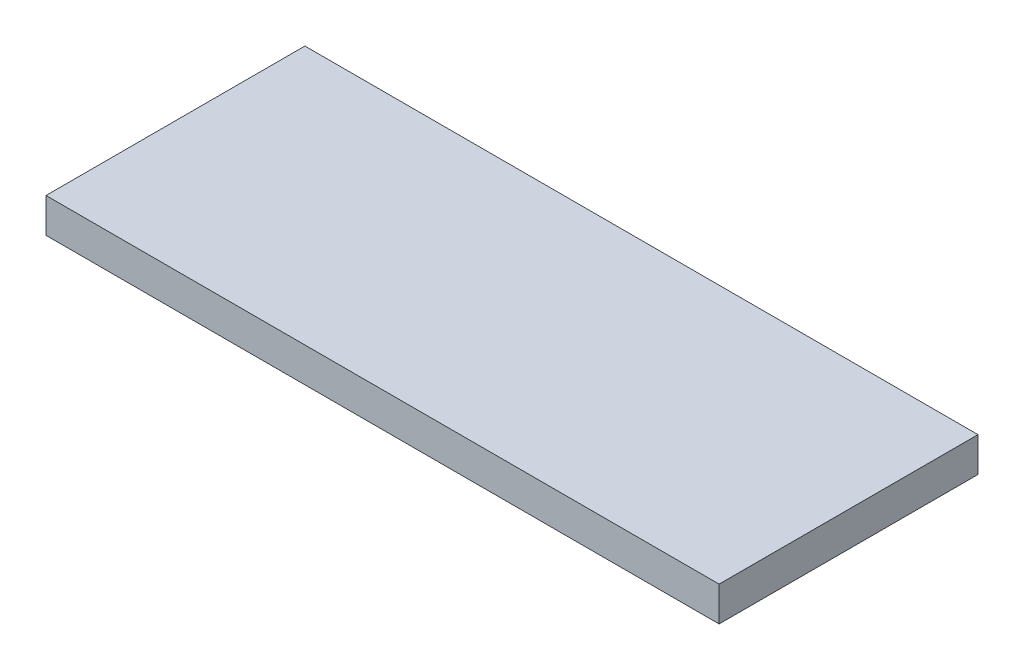
ISO-10303-21;
HEADER;
FILE_DESCRIPTION(('STEP AP214'),'2;1');
FILE_NAME('part.step','',(''),(''),'','','');
FILE_SCHEMA(('AUTOMOTIVE_DESIGN { 1 0 10303 214 1 1 1 1 }'));
ENDSEC;
DATA;
#1=APPLICATION_CONTEXT('core data for automotive mechanical design processes');
#2=APPLICATION_PROTOCOL_DEFINITION('international standard','automotive_design',2000,#1);
#3=PRODUCT_CONTEXT('',#1,'mechanical');
#4=PRODUCT('Part','Part','',(#3));
#5=PRODUCT_RELATED_PRODUCT_CATEGORY('part','',(#4));
#6=PRODUCT_DEFINITION_FORMATION('','',#4);
#7=PRODUCT_DEFINITION_CONTEXT('part definition',#1,'design');
#8=PRODUCT_DEFINITION('design','',#6,#7);
#9=PRODUCT_DEFINITION_SHAPE('','',#8);
#10=(LENGTH_UNIT() NAMED_UNIT(*) SI_UNIT(.MILLI.,.METRE.));
#11=(NAMED_UNIT(*) PLANE_ANGLE_UNIT() SI_UNIT($,.RADIAN.));
#12=(NAMED_UNIT(*) SI_UNIT($,.STERADIAN.) SOLID_ANGLE_UNIT());
#13=UNCERTAINTY_MEASURE_WITH_UNIT(LENGTH_MEASURE(1.E-05),#10,'distance_accuracy_value','');
#14=(GEOMETRIC_REPRESENTATION_CONTEXT(3) GLOBAL_UNCERTAINTY_ASSIGNED_CONTEXT((#13)) GLOBAL_UNIT_ASSIGNED_CONTEXT((#10,
#11,#12)) REPRESENTATION_CONTEXT('',''));
#15=CARTESIAN_POINT('',(0.,0.,0.));
#16=DIRECTION('',(0.,0.,1.));
#17=DIRECTION('',(1.,0.,0.));
#18=AXIS2_PLACEMENT_3D('',#15,#16,#17);
#19=CARTESIAN_POINT('',(9.75,1.,3.75));
#20=DIRECTION('',(-1.,0.,0.));
#21=DIRECTION('',(0.,0.,1.));
#22=AXIS2_PLACEMENT_3D('',#19,#20,#21);
#23=PLANE('',#22);
#24=DIRECTION('',(0.,0.,-1.));
#25=VECTOR('',#24,1.);
#26=CARTESIAN_POINT('',(9.75,0.,3.75));
#27=LINE('',#26,#25);
#28=CARTESIAN_POINT('',(9.75,0.,3.75));
#29=VERTEX_POINT('',#28);
#30=CARTESIAN_POINT('',(9.75,0.,-3.75));
#31=VERTEX_POINT('',#30);
#32=EDGE_CURVE('E94',#29,#31,#27,.T.);
#33=ORIENTED_EDGE('',*,*,#32,.T.);
#34=DIRECTION('',(0.,-1.,0.));
#35=VECTOR('',#34,1.);
#36=CARTESIAN_POINT('',(9.75,1.,-3.75));
#37=LINE('',#36,#35);
#38=CARTESIAN_POINT('',(9.75,1.,-3.75));
#39=VERTEX_POINT('',#38);
#40=EDGE_CURVE('E11',#39,#31,#37,.T.);
#41=ORIENTED_EDGE('',*,*,#40,.F.);
#42=DIRECTION('',(0.,0.,-1.));
#43=VECTOR('',#42,1.);
#44=CARTESIAN_POINT('',(9.75,1.,3.75));
#45=LINE('',#44,#43);
#46=CARTESIAN_POINT('',(9.75,1.,3.75));
#47=VERTEX_POINT('',#46);
#48=EDGE_CURVE('E82',#47,#39,#45,.T.);
#49=ORIENTED_EDGE('',*,*,#48,.F.);
#50=DIRECTION('',(0.,-1.,0.));
#51=VECTOR('',#50,1.);
#52=CARTESIAN_POINT('',(9.75,1.,3.75));
#53=LINE('',#52,#51);
#54=EDGE_CURVE('E90',#47,#29,#53,.T.);
#55=ORIENTED_EDGE('',*,*,#54,.T.);
#56=EDGE_LOOP('',(#33,#41,#49,#55));
#57=FACE_BOUND('',#56,.T.);
#58=ADVANCED_FACE('F31',(#57),#23,.F.);
#59=CARTESIAN_POINT('',(-9.75,1.,-3.75));
#60=DIRECTION('',(0.,0.,1.));
#61=DIRECTION('',(1.,0.,0.));
#62=AXIS2_PLACEMENT_3D('',#59,#60,#61);
#63=PLANE('',#62);
#64=DIRECTION('',(-1.,0.,0.));
#65=VECTOR('',#64,1.);
#66=CARTESIAN_POINT('',(-9.75,0.,-3.75));
#67=LINE('',#66,#65);
#68=CARTESIAN_POINT('',(-9.75,0.,-3.75));
#69=VERTEX_POINT('',#68);
#70=EDGE_CURVE('E86',#31,#69,#67,.T.);
#71=ORIENTED_EDGE('',*,*,#70,.T.);
#72=DIRECTION('',(0.,-1.,0.));
#73=VECTOR('',#72,1.);
#74=CARTESIAN_POINT('',(-9.75,1.,-3.75));
#75=LINE('',#74,#73);
#76=CARTESIAN_POINT('',(-9.75,1.,-3.75));
#77=VERTEX_POINT('',#76);
#78=EDGE_CURVE('E39',#77,#69,#75,.T.);
#79=ORIENTED_EDGE('',*,*,#78,.F.);
#80=DIRECTION('',(-1.,0.,0.));
#81=VECTOR('',#80,1.);
#82=CARTESIAN_POINT('',(-9.75,1.,-3.75));
#83=LINE('',#82,#81);
#84=EDGE_CURVE('E77',#39,#77,#83,.T.);
#85=ORIENTED_EDGE('',*,*,#84,.F.);
#86=ORIENTED_EDGE('',*,*,#40,.T.);
#87=EDGE_LOOP('',(#71,#79,#85,#86));
#88=FACE_BOUND('',#87,.T.);
#89=ADVANCED_FACE('F85',(#88),#63,.F.);
#90=CARTESIAN_POINT('',(-9.75,1.,3.75));
#91=DIRECTION('',(1.,0.,0.));
#92=DIRECTION('',(0.,0.,-1.));
#93=AXIS2_PLACEMENT_3D('',#90,#91,#92);
#94=PLANE('',#93);
#95=DIRECTION('',(0.,0.,1.));
#96=VECTOR('',#95,1.);
#97=CARTESIAN_POINT('',(-9.75,0.,3.75));
#98=LINE('',#97,#96);
#99=CARTESIAN_POINT('',(-9.75,0.,3.75));
#100=VERTEX_POINT('',#99);
#101=EDGE_CURVE('E64',#69,#100,#98,.T.);
#102=ORIENTED_EDGE('',*,*,#101,.T.);
#103=DIRECTION('',(0.,-1.,0.));
#104=VECTOR('',#103,1.);
#105=CARTESIAN_POINT('',(-9.75,1.,3.75));
#106=LINE('',#105,#104);
#107=CARTESIAN_POINT('',(-9.75,1.,3.75));
#108=VERTEX_POINT('',#107);
#109=EDGE_CURVE('E87',#108,#100,#106,.T.);
#110=ORIENTED_EDGE('',*,*,#109,.F.);
#111=DIRECTION('',(0.,0.,1.));
#112=VECTOR('',#111,1.);
#113=CARTESIAN_POINT('',(-9.75,1.,3.75));
#114=LINE('',#113,#112);
#115=EDGE_CURVE('E80',#77,#108,#114,.T.);
#116=ORIENTED_EDGE('',*,*,#115,.F.);
#117=ORIENTED_EDGE('',*,*,#78,.T.);
#118=EDGE_LOOP('',(#102,#110,#116,#117));
#119=FACE_BOUND('',#118,.T.);
#120=ADVANCED_FACE('F88',(#119),#94,.F.);
#121=CARTESIAN_POINT('',(-9.75,1.,3.75));
#122=DIRECTION('',(0.,0.,-1.));
#123=DIRECTION('',(-1.,0.,0.));
#124=AXIS2_PLACEMENT_3D('',#121,#122,#123);
#125=PLANE('',#124);
#126=DIRECTION('',(1.,0.,0.));
#127=VECTOR('',#126,1.);
#128=CARTESIAN_POINT('',(-9.75,0.,3.75));
#129=LINE('',#128,#127);
#130=EDGE_CURVE('E70',#100,#29,#129,.T.);
#131=ORIENTED_EDGE('',*,*,#130,.T.);
#132=ORIENTED_EDGE('',*,*,#54,.F.);
#133=DIRECTION('',(1.,0.,0.));
#134=VECTOR('',#133,1.);
#135=CARTESIAN_POINT('',(-9.75,1.,3.75));
#136=LINE('',#135,#134);
#137=EDGE_CURVE('E47',#108,#47,#136,.T.);
#138=ORIENTED_EDGE('',*,*,#137,.F.);
#139=ORIENTED_EDGE('',*,*,#109,.T.);
#140=EDGE_LOOP('',(#131,#132,#138,#139));
#141=FACE_BOUND('',#140,.T.);
#142=ADVANCED_FACE('F101',(#141),#125,.F.);
#143=CARTESIAN_POINT('',(9.75,1.,-3.75));
#144=DIRECTION('',(0.,-1.,0.));
#145=DIRECTION('',(0.,0.,-1.));
#146=AXIS2_PLACEMENT_3D('',#143,#144,#145);
#147=PLANE('',#146);
#148=ORIENTED_EDGE('',*,*,#48,.T.);
#149=ORIENTED_EDGE('',*,*,#84,.T.);
#150=ORIENTED_EDGE('',*,*,#115,.T.);
#151=ORIENTED_EDGE('',*,*,#137,.T.);
#152=EDGE_LOOP('',(#148,#149,#150,#151));
#153=FACE_BOUND('',#152,.T.);
#154=ADVANCED_FACE('F78',(#153),#147,.F.);
#155=CARTESIAN_POINT('',(9.75,0.,-3.75));
#156=DIRECTION('',(0.,-1.,0.));
#157=DIRECTION('',(0.,0.,-1.));
#158=AXIS2_PLACEMENT_3D('',#155,#156,#157);
#159=PLANE('',#158);
#160=ORIENTED_EDGE('',*,*,#32,.F.);
#161=ORIENTED_EDGE('',*,*,#130,.F.);
#162=ORIENTED_EDGE('',*,*,#101,.F.);
#163=ORIENTED_EDGE('',*,*,#70,.F.);
#164=EDGE_LOOP('',(#160,#161,#162,#163));
#165=FACE_BOUND('',#164,.T.);
#166=ADVANCED_FACE('F104',(#165),#159,.T.);
#167=CLOSED_SHELL('',(#58,#89,#120,#142,#154,#166));
#168=MANIFOLD_SOLID_BREP('B2',#167);
#169=ADVANCED_BREP_SHAPE_REPRESENTATION('',(#18,#168),#14);
#170=SHAPE_DEFINITION_REPRESENTATION(#9,#169);
ENDSEC;
END-ISO-10303-21;
